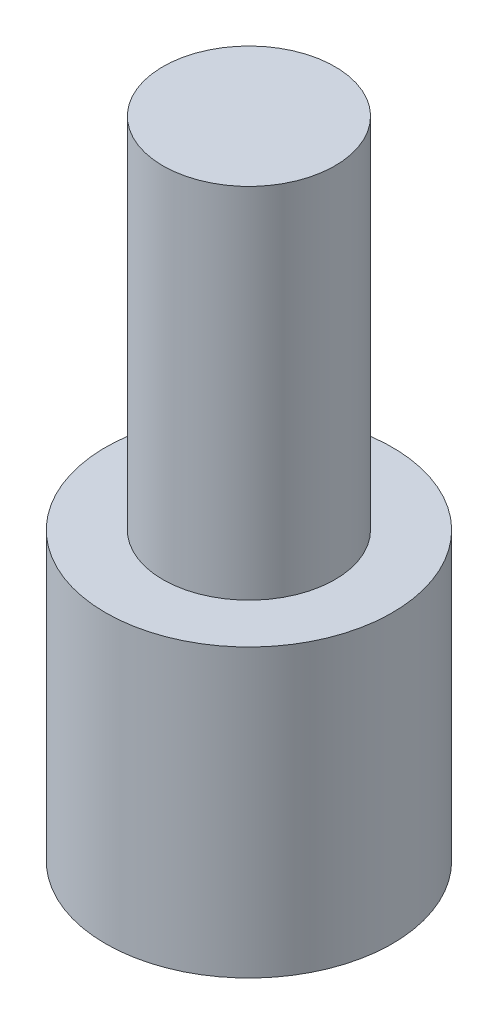
ISO-10303-21;
HEADER;
FILE_DESCRIPTION(('STEP AP214'),'2;1');
FILE_NAME('part.step','',(''),(''),'','','');
FILE_SCHEMA(('AUTOMOTIVE_DESIGN { 1 0 10303 214 1 1 1 1 }'));
ENDSEC;
DATA;
#1=APPLICATION_CONTEXT('core data for automotive mechanical design processes');
#2=APPLICATION_PROTOCOL_DEFINITION('international standard','automotive_design',2000,#1);
#3=PRODUCT_CONTEXT('',#1,'mechanical');
#4=PRODUCT('Part','Part','',(#3));
#5=PRODUCT_RELATED_PRODUCT_CATEGORY('part','',(#4));
#6=PRODUCT_DEFINITION_FORMATION('','',#4);
#7=PRODUCT_DEFINITION_CONTEXT('part definition',#1,'design');
#8=PRODUCT_DEFINITION('design','',#6,#7);
#9=PRODUCT_DEFINITION_SHAPE('','',#8);
#10=(LENGTH_UNIT() NAMED_UNIT(*) SI_UNIT(.MILLI.,.METRE.));
#11=(NAMED_UNIT(*) PLANE_ANGLE_UNIT() SI_UNIT($,.RADIAN.));
#12=(NAMED_UNIT(*) SI_UNIT($,.STERADIAN.) SOLID_ANGLE_UNIT());
#13=UNCERTAINTY_MEASURE_WITH_UNIT(LENGTH_MEASURE(1.E-05),#10,'distance_accuracy_value','');
#14=(GEOMETRIC_REPRESENTATION_CONTEXT(3) GLOBAL_UNCERTAINTY_ASSIGNED_CONTEXT((#13)) GLOBAL_UNIT_ASSIGNED_CONTEXT((#10,
#11,#12)) REPRESENTATION_CONTEXT('',''));
#15=CARTESIAN_POINT('',(0.,0.,0.));
#16=DIRECTION('',(0.,0.,1.));
#17=DIRECTION('',(1.,0.,0.));
#18=AXIS2_PLACEMENT_3D('',#15,#16,#17);
#19=CARTESIAN_POINT('',(0.,10.,0.));
#20=DIRECTION('',(0.,-1.,0.));
#21=DIRECTION('',(0.,0.,-1.));
#22=AXIS2_PLACEMENT_3D('',#19,#20,#21);
#23=CYLINDRICAL_SURFACE('',#22,5.);
#24=CARTESIAN_POINT('',(0.,10.,0.));
#25=DIRECTION('',(0.,1.,0.));
#26=DIRECTION('',(0.,0.,1.));
#27=AXIS2_PLACEMENT_3D('',#24,#25,#26);
#28=CIRCLE('',#27,5.);
#29=CARTESIAN_POINT('',(0.,10.,5.));
#30=VERTEX_POINT('',#29);
#31=EDGE_CURVE('E44',#30,#30,#28,.T.);
#32=ORIENTED_EDGE('',*,*,#31,.F.);
#33=EDGE_LOOP('',(#32));
#34=FACE_BOUND('',#33,.T.);
#35=CARTESIAN_POINT('',(0.,0.,0.));
#36=DIRECTION('',(0.,1.,0.));
#37=DIRECTION('',(0.,0.,1.));
#38=AXIS2_PLACEMENT_3D('',#35,#36,#37);
#39=CIRCLE('',#38,5.);
#40=CARTESIAN_POINT('',(0.,0.,5.));
#41=VERTEX_POINT('',#40);
#42=EDGE_CURVE('E40',#41,#41,#39,.T.);
#43=ORIENTED_EDGE('',*,*,#42,.T.);
#44=EDGE_LOOP('',(#43));
#45=FACE_BOUND('',#44,.T.);
#46=ADVANCED_FACE('F37',(#34,#45),#23,.T.);
#47=CARTESIAN_POINT('',(0.,10.,0.));
#48=DIRECTION('',(0.,1.,0.));
#49=DIRECTION('',(0.,0.,1.));
#50=AXIS2_PLACEMENT_3D('',#47,#48,#49);
#51=PLANE('',#50);
#52=CARTESIAN_POINT('',(0.,10.,0.));
#53=DIRECTION('',(0.,1.,0.));
#54=DIRECTION('',(0.,0.,1.));
#55=AXIS2_PLACEMENT_3D('',#52,#53,#54);
#56=CIRCLE('',#55,3.);
#57=CARTESIAN_POINT('',(0.,10.,3.));
#58=VERTEX_POINT('',#57);
#59=EDGE_CURVE('E10',#58,#58,#56,.T.);
#60=ORIENTED_EDGE('',*,*,#59,.F.);
#61=EDGE_LOOP('',(#60));
#62=FACE_BOUND('',#61,.T.);
#63=ORIENTED_EDGE('',*,*,#31,.T.);
#64=EDGE_LOOP('',(#63));
#65=FACE_BOUND('',#64,.T.);
#66=ADVANCED_FACE('F78',(#62,#65),#51,.T.);
#67=CARTESIAN_POINT('',(0.,0.,0.));
#68=DIRECTION('',(0.,1.,0.));
#69=DIRECTION('',(0.,0.,1.));
#70=AXIS2_PLACEMENT_3D('',#67,#68,#69);
#71=PLANE('',#70);
#72=CARTESIAN_POINT('',(0.,0.,0.));
#73=DIRECTION('',(0.,-1.,0.));
#74=DIRECTION('',(0.,0.,-1.));
#75=AXIS2_PLACEMENT_3D('',#72,#73,#74);
#76=CIRCLE('',#75,2.5);
#77=CARTESIAN_POINT('',(0.,0.,-2.5));
#78=VERTEX_POINT('',#77);
#79=EDGE_CURVE('E55',#78,#78,#76,.T.);
#80=ORIENTED_EDGE('',*,*,#79,.F.);
#81=EDGE_LOOP('',(#80));
#82=FACE_BOUND('',#81,.T.);
#83=ORIENTED_EDGE('',*,*,#42,.F.);
#84=EDGE_LOOP('',(#83));
#85=FACE_BOUND('',#84,.T.);
#86=ADVANCED_FACE('F83',(#82,#85),#71,.F.);
#87=CARTESIAN_POINT('',(0.,8.,0.));
#88=DIRECTION('',(0.,-1.,0.));
#89=DIRECTION('',(0.,0.,-1.));
#90=AXIS2_PLACEMENT_3D('',#87,#88,#89);
#91=CYLINDRICAL_SURFACE('',#90,2.5);
#92=CARTESIAN_POINT('',(0.,8.,0.));
#93=DIRECTION('',(0.,-1.,0.));
#94=DIRECTION('',(0.,0.,-1.));
#95=AXIS2_PLACEMENT_3D('',#92,#93,#94);
#96=CIRCLE('',#95,2.5);
#97=CARTESIAN_POINT('',(0.,8.,-2.5));
#98=VERTEX_POINT('',#97);
#99=EDGE_CURVE('E52',#98,#98,#96,.T.);
#100=ORIENTED_EDGE('',*,*,#99,.F.);
#101=EDGE_LOOP('',(#100));
#102=FACE_BOUND('',#101,.T.);
#103=ORIENTED_EDGE('',*,*,#79,.T.);
#104=EDGE_LOOP('',(#103));
#105=FACE_BOUND('',#104,.T.);
#106=ADVANCED_FACE('F74',(#102,#105),#91,.F.);
#107=CARTESIAN_POINT('',(0.,8.,0.));
#108=DIRECTION('',(0.,-1.,0.));
#109=DIRECTION('',(0.,0.,-1.));
#110=AXIS2_PLACEMENT_3D('',#107,#108,#109);
#111=PLANE('',#110);
#112=ORIENTED_EDGE('',*,*,#99,.T.);
#113=EDGE_LOOP('',(#112));
#114=FACE_BOUND('',#113,.T.);
#115=ADVANCED_FACE('F66',(#114),#111,.T.);
#116=CARTESIAN_POINT('',(0.,22.5,0.));
#117=DIRECTION('',(0.,-1.,0.));
#118=DIRECTION('',(0.,0.,-1.));
#119=AXIS2_PLACEMENT_3D('',#116,#117,#118);
#120=CYLINDRICAL_SURFACE('',#119,3.);
#121=CARTESIAN_POINT('',(0.,22.5,0.));
#122=DIRECTION('',(0.,1.,0.));
#123=DIRECTION('',(0.,0.,1.));
#124=AXIS2_PLACEMENT_3D('',#121,#122,#123);
#125=CIRCLE('',#124,3.);
#126=CARTESIAN_POINT('',(0.,22.5,3.));
#127=VERTEX_POINT('',#126);
#128=EDGE_CURVE('E51',#127,#127,#125,.T.);
#129=ORIENTED_EDGE('',*,*,#128,.F.);
#130=EDGE_LOOP('',(#129));
#131=FACE_BOUND('',#130,.T.);
#132=ORIENTED_EDGE('',*,*,#59,.T.);
#133=EDGE_LOOP('',(#132));
#134=FACE_BOUND('',#133,.T.);
#135=ADVANCED_FACE('F64',(#131,#134),#120,.T.);
#136=CARTESIAN_POINT('',(0.,22.5,0.));
#137=DIRECTION('',(0.,1.,0.));
#138=DIRECTION('',(0.,0.,1.));
#139=AXIS2_PLACEMENT_3D('',#136,#137,#138);
#140=PLANE('',#139);
#141=ORIENTED_EDGE('',*,*,#128,.T.);
#142=EDGE_LOOP('',(#141));
#143=FACE_BOUND('',#142,.T.);
#144=ADVANCED_FACE('F62',(#143),#140,.T.);
#145=CLOSED_SHELL('',(#46,#66,#86,#106,#115,#135,#144));
#146=MANIFOLD_SOLID_BREP('B2',#145);
#147=ADVANCED_BREP_SHAPE_REPRESENTATION('',(#18,#146),#14);
#148=SHAPE_DEFINITION_REPRESENTATION(#9,#147);
ENDSEC;
END-ISO-10303-21;
